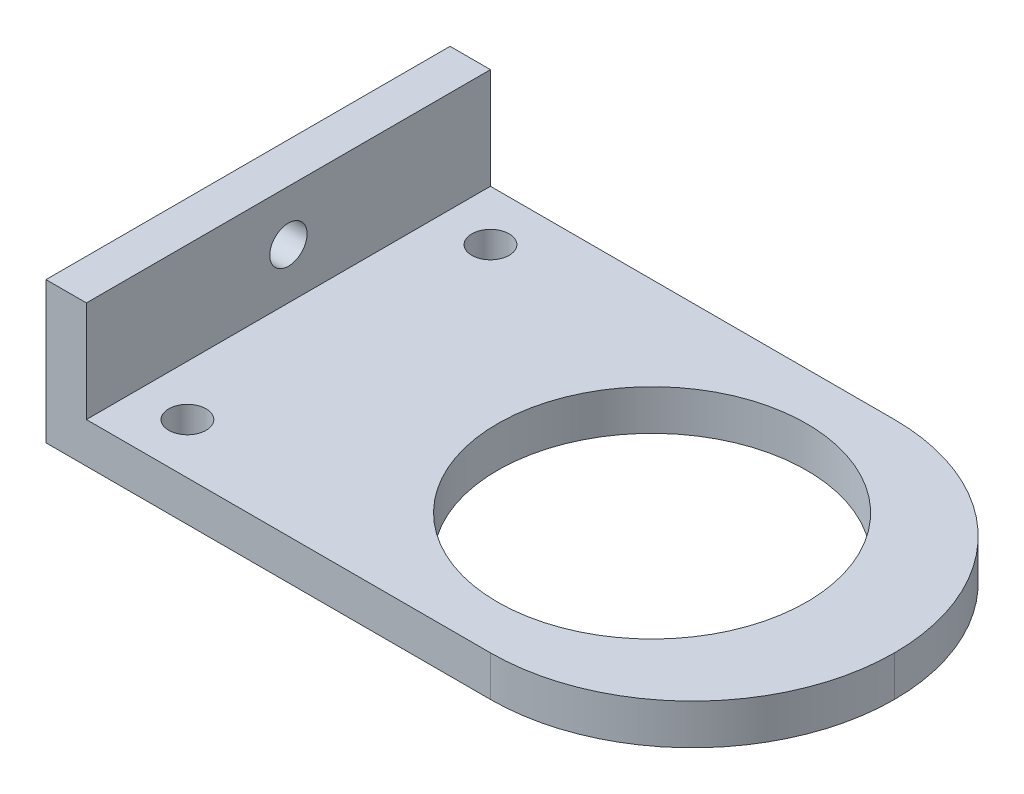
ISO-10303-21;
HEADER;
FILE_DESCRIPTION(('STEP AP214'),'2;1');
FILE_NAME('part.step','',(''),(''),'','','');
FILE_SCHEMA(('AUTOMOTIVE_DESIGN { 1 0 10303 214 1 1 1 1 }'));
ENDSEC;
DATA;
#1=APPLICATION_CONTEXT('core data for automotive mechanical design processes');
#2=APPLICATION_PROTOCOL_DEFINITION('international standard','automotive_design',2000,#1);
#3=PRODUCT_CONTEXT('',#1,'mechanical');
#4=PRODUCT('Part','Part','',(#3));
#5=PRODUCT_RELATED_PRODUCT_CATEGORY('part','',(#4));
#6=PRODUCT_DEFINITION_FORMATION('','',#4);
#7=PRODUCT_DEFINITION_CONTEXT('part definition',#1,'design');
#8=PRODUCT_DEFINITION('design','',#6,#7);
#9=PRODUCT_DEFINITION_SHAPE('','',#8);
#10=(LENGTH_UNIT() NAMED_UNIT(*) SI_UNIT(.MILLI.,.METRE.));
#11=(NAMED_UNIT(*) PLANE_ANGLE_UNIT() SI_UNIT($,.RADIAN.));
#12=(NAMED_UNIT(*) SI_UNIT($,.STERADIAN.) SOLID_ANGLE_UNIT());
#13=UNCERTAINTY_MEASURE_WITH_UNIT(LENGTH_MEASURE(1.E-05),#10,'distance_accuracy_value','');
#14=(GEOMETRIC_REPRESENTATION_CONTEXT(3) GLOBAL_UNCERTAINTY_ASSIGNED_CONTEXT((#13)) GLOBAL_UNIT_ASSIGNED_CONTEXT((#10,
#11,#12)) REPRESENTATION_CONTEXT('',''));
#15=CARTESIAN_POINT('',(0.,0.,0.));
#16=DIRECTION('',(0.,0.,1.));
#17=DIRECTION('',(1.,0.,0.));
#18=AXIS2_PLACEMENT_3D('',#15,#16,#17);
#19=CARTESIAN_POINT('',(0.,10.,40.));
#20=DIRECTION('',(0.,-1.,0.));
#21=DIRECTION('',(0.,0.,-1.));
#22=AXIS2_PLACEMENT_3D('',#19,#20,#21);
#23=PLANE('',#22);
#24=DIRECTION('',(-1.,0.,0.));
#25=VECTOR('',#24,1.);
#26=CARTESIAN_POINT('',(0.,10.,0.));
#27=LINE('',#26,#25);
#28=CARTESIAN_POINT('',(0.,10.,0.));
#29=VERTEX_POINT('',#28);
#30=CARTESIAN_POINT('',(-4.,10.,0.));
#31=VERTEX_POINT('',#30);
#32=EDGE_CURVE('E114',#29,#31,#27,.T.);
#33=ORIENTED_EDGE('',*,*,#32,.T.);
#34=DIRECTION('',(0.,0.,-1.));
#35=VECTOR('',#34,1.);
#36=CARTESIAN_POINT('',(-4.,10.,40.));
#37=LINE('',#36,#35);
#38=CARTESIAN_POINT('',(-4.,10.,40.));
#39=VERTEX_POINT('',#38);
#40=EDGE_CURVE('E96',#39,#31,#37,.T.);
#41=ORIENTED_EDGE('',*,*,#40,.F.);
#42=DIRECTION('',(-1.,0.,0.));
#43=VECTOR('',#42,1.);
#44=CARTESIAN_POINT('',(0.,10.,40.));
#45=LINE('',#44,#43);
#46=CARTESIAN_POINT('',(0.,10.,40.));
#47=VERTEX_POINT('',#46);
#48=EDGE_CURVE('E102',#47,#39,#45,.T.);
#49=ORIENTED_EDGE('',*,*,#48,.F.);
#50=DIRECTION('',(0.,0.,-1.));
#51=VECTOR('',#50,1.);
#52=CARTESIAN_POINT('',(0.,10.,40.));
#53=LINE('',#52,#51);
#54=EDGE_CURVE('E146',#47,#29,#53,.T.);
#55=ORIENTED_EDGE('',*,*,#54,.T.);
#56=EDGE_LOOP('',(#33,#41,#49,#55));
#57=FACE_BOUND('',#56,.T.);
#58=ADVANCED_FACE('F35',(#57),#23,.F.);
#59=CARTESIAN_POINT('',(-4.,10.,40.));
#60=DIRECTION('',(1.,0.,0.));
#61=DIRECTION('',(0.,0.,-1.));
#62=AXIS2_PLACEMENT_3D('',#59,#60,#61);
#63=PLANE('',#62);
#64=CARTESIAN_POINT('',(-4.,5.,20.));
#65=DIRECTION('',(1.,0.,0.));
#66=DIRECTION('',(0.,0.,-1.));
#67=AXIS2_PLACEMENT_3D('',#64,#65,#66);
#68=CIRCLE('',#67,1.85);
#69=CARTESIAN_POINT('',(-4.,5.,18.15));
#70=VERTEX_POINT('',#69);
#71=EDGE_CURVE('E153',#70,#70,#68,.T.);
#72=ORIENTED_EDGE('',*,*,#71,.T.);
#73=EDGE_LOOP('',(#72));
#74=FACE_BOUND('',#73,.T.);
#75=DIRECTION('',(0.,-1.,0.));
#76=VECTOR('',#75,1.);
#77=CARTESIAN_POINT('',(-4.,10.,0.));
#78=LINE('',#77,#76);
#79=CARTESIAN_POINT('',(-4.,-4.,0.));
#80=VERTEX_POINT('',#79);
#81=EDGE_CURVE('E139',#31,#80,#78,.T.);
#82=ORIENTED_EDGE('',*,*,#81,.T.);
#83=DIRECTION('',(0.,0.,-1.));
#84=VECTOR('',#83,1.);
#85=CARTESIAN_POINT('',(-4.,-4.,40.));
#86=LINE('',#85,#84);
#87=CARTESIAN_POINT('',(-4.,-4.,40.));
#88=VERTEX_POINT('',#87);
#89=EDGE_CURVE('E99',#88,#80,#86,.T.);
#90=ORIENTED_EDGE('',*,*,#89,.F.);
#91=DIRECTION('',(0.,-1.,0.));
#92=VECTOR('',#91,1.);
#93=CARTESIAN_POINT('',(-4.,10.,40.));
#94=LINE('',#93,#92);
#95=EDGE_CURVE('E92',#39,#88,#94,.T.);
#96=ORIENTED_EDGE('',*,*,#95,.F.);
#97=ORIENTED_EDGE('',*,*,#40,.T.);
#98=EDGE_LOOP('',(#82,#90,#96,#97));
#99=FACE_BOUND('',#98,.T.);
#100=ADVANCED_FACE('F94',(#74,#99),#63,.F.);
#101=CARTESIAN_POINT('',(-4.,-4.,40.));
#102=DIRECTION('',(0.,1.,0.));
#103=DIRECTION('',(0.,0.,1.));
#104=AXIS2_PLACEMENT_3D('',#101,#102,#103);
#105=PLANE('',#104);
#106=CARTESIAN_POINT('',(5.,-4.,5.));
#107=DIRECTION('',(0.,1.,0.));
#108=DIRECTION('',(0.,0.,1.));
#109=AXIS2_PLACEMENT_3D('',#106,#107,#108);
#110=CIRCLE('',#109,1.85);
#111=CARTESIAN_POINT('',(5.,-4.,6.85));
#112=VERTEX_POINT('',#111);
#113=EDGE_CURVE('E170',#112,#112,#110,.T.);
#114=ORIENTED_EDGE('',*,*,#113,.T.);
#115=EDGE_LOOP('',(#114));
#116=FACE_BOUND('',#115,.T.);
#117=CARTESIAN_POINT('',(5.,-4.,35.));
#118=DIRECTION('',(0.,1.,0.));
#119=DIRECTION('',(0.,0.,1.));
#120=AXIS2_PLACEMENT_3D('',#117,#118,#119);
#121=CIRCLE('',#120,1.85);
#122=CARTESIAN_POINT('',(5.,-4.,36.85));
#123=VERTEX_POINT('',#122);
#124=EDGE_CURVE('E173',#123,#123,#121,.T.);
#125=ORIENTED_EDGE('',*,*,#124,.T.);
#126=EDGE_LOOP('',(#125));
#127=FACE_BOUND('',#126,.T.);
#128=CARTESIAN_POINT('',(36.,-4.,20.));
#129=DIRECTION('',(0.,1.,0.));
#130=DIRECTION('',(0.,0.,1.));
#131=AXIS2_PLACEMENT_3D('',#128,#129,#130);
#132=CIRCLE('',#131,15.3);
#133=CARTESIAN_POINT('',(36.,-4.,35.3));
#134=VERTEX_POINT('',#133);
#135=EDGE_CURVE('E164',#134,#134,#132,.T.);
#136=ORIENTED_EDGE('',*,*,#135,.T.);
#137=EDGE_LOOP('',(#136));
#138=FACE_BOUND('',#137,.T.);
#139=DIRECTION('',(1.,0.,0.));
#140=VECTOR('',#139,1.);
#141=CARTESIAN_POINT('',(-4.,-4.,0.));
#142=LINE('',#141,#140);
#143=CARTESIAN_POINT('',(40.,-4.,0.));
#144=VERTEX_POINT('',#143);
#145=EDGE_CURVE('E133',#80,#144,#142,.T.);
#146=ORIENTED_EDGE('',*,*,#145,.T.);
#147=CARTESIAN_POINT('',(40.,-4.,20.));
#148=DIRECTION('',(0.,1.,0.));
#149=DIRECTION('',(0.,0.,1.));
#150=AXIS2_PLACEMENT_3D('',#147,#148,#149);
#151=CIRCLE('',#150,20.);
#152=CARTESIAN_POINT('',(60.,-4.,20.));
#153=VERTEX_POINT('',#152);
#154=EDGE_CURVE('E44',#144,#153,#151,.F.);
#155=ORIENTED_EDGE('',*,*,#154,.T.);
#156=CARTESIAN_POINT('',(40.,-4.,20.));
#157=DIRECTION('',(0.,1.,0.));
#158=DIRECTION('',(0.,0.,1.));
#159=AXIS2_PLACEMENT_3D('',#156,#157,#158);
#160=CIRCLE('',#159,20.);
#161=CARTESIAN_POINT('',(40.,-4.,40.));
#162=VERTEX_POINT('',#161);
#163=EDGE_CURVE('E51',#153,#162,#160,.F.);
#164=ORIENTED_EDGE('',*,*,#163,.T.);
#165=DIRECTION('',(1.,0.,0.));
#166=VECTOR('',#165,1.);
#167=CARTESIAN_POINT('',(-4.,-4.,40.));
#168=LINE('',#167,#166);
#169=EDGE_CURVE('E101',#88,#162,#168,.T.);
#170=ORIENTED_EDGE('',*,*,#169,.F.);
#171=ORIENTED_EDGE('',*,*,#89,.T.);
#172=EDGE_LOOP('',(#146,#155,#164,#170,#171));
#173=FACE_BOUND('',#172,.T.);
#174=ADVANCED_FACE('F138',(#116,#127,#138,#173),#105,.F.);
#175=CARTESIAN_POINT('',(0.,0.,40.));
#176=DIRECTION('',(0.,-1.,0.));
#177=DIRECTION('',(0.,0.,-1.));
#178=AXIS2_PLACEMENT_3D('',#175,#176,#177);
#179=PLANE('',#178);
#180=CARTESIAN_POINT('',(5.,0.,5.));
#181=DIRECTION('',(0.,1.,0.));
#182=DIRECTION('',(0.,0.,1.));
#183=AXIS2_PLACEMENT_3D('',#180,#181,#182);
#184=CIRCLE('',#183,1.85);
#185=CARTESIAN_POINT('',(5.,0.,6.85));
#186=VERTEX_POINT('',#185);
#187=EDGE_CURVE('E176',#186,#186,#184,.T.);
#188=ORIENTED_EDGE('',*,*,#187,.F.);
#189=EDGE_LOOP('',(#188));
#190=FACE_BOUND('',#189,.T.);
#191=CARTESIAN_POINT('',(5.,0.,35.));
#192=DIRECTION('',(0.,1.,0.));
#193=DIRECTION('',(0.,0.,1.));
#194=AXIS2_PLACEMENT_3D('',#191,#192,#193);
#195=CIRCLE('',#194,1.85);
#196=CARTESIAN_POINT('',(5.,0.,36.85));
#197=VERTEX_POINT('',#196);
#198=EDGE_CURVE('E177',#197,#197,#195,.T.);
#199=ORIENTED_EDGE('',*,*,#198,.F.);
#200=EDGE_LOOP('',(#199));
#201=FACE_BOUND('',#200,.T.);
#202=CARTESIAN_POINT('',(36.,0.,20.));
#203=DIRECTION('',(0.,1.,0.));
#204=DIRECTION('',(0.,0.,1.));
#205=AXIS2_PLACEMENT_3D('',#202,#203,#204);
#206=CIRCLE('',#205,15.3);
#207=CARTESIAN_POINT('',(36.,0.,35.3));
#208=VERTEX_POINT('',#207);
#209=EDGE_CURVE('E167',#208,#208,#206,.T.);
#210=ORIENTED_EDGE('',*,*,#209,.F.);
#211=EDGE_LOOP('',(#210));
#212=FACE_BOUND('',#211,.T.);
#213=CARTESIAN_POINT('',(40.,0.,20.));
#214=DIRECTION('',(0.,-1.,0.));
#215=DIRECTION('',(0.,0.,-1.));
#216=AXIS2_PLACEMENT_3D('',#213,#214,#215);
#217=CIRCLE('',#216,20.);
#218=CARTESIAN_POINT('',(40.,0.,40.));
#219=VERTEX_POINT('',#218);
#220=CARTESIAN_POINT('',(60.,0.,20.));
#221=VERTEX_POINT('',#220);
#222=EDGE_CURVE('E115',#219,#221,#217,.F.);
#223=ORIENTED_EDGE('',*,*,#222,.T.);
#224=CARTESIAN_POINT('',(40.,0.,20.));
#225=DIRECTION('',(0.,-1.,0.));
#226=DIRECTION('',(0.,0.,-1.));
#227=AXIS2_PLACEMENT_3D('',#224,#225,#226);
#228=CIRCLE('',#227,20.);
#229=CARTESIAN_POINT('',(40.,0.,0.));
#230=VERTEX_POINT('',#229);
#231=EDGE_CURVE('E117',#221,#230,#228,.F.);
#232=ORIENTED_EDGE('',*,*,#231,.T.);
#233=DIRECTION('',(-1.,0.,0.));
#234=VECTOR('',#233,1.);
#235=CARTESIAN_POINT('',(0.,0.,0.));
#236=LINE('',#235,#234);
#237=CARTESIAN_POINT('',(0.,0.,0.));
#238=VERTEX_POINT('',#237);
#239=EDGE_CURVE('E135',#230,#238,#236,.T.);
#240=ORIENTED_EDGE('',*,*,#239,.T.);
#241=DIRECTION('',(0.,0.,-1.));
#242=VECTOR('',#241,1.);
#243=CARTESIAN_POINT('',(0.,0.,40.));
#244=LINE('',#243,#242);
#245=CARTESIAN_POINT('',(0.,0.,40.));
#246=VERTEX_POINT('',#245);
#247=EDGE_CURVE('E119',#246,#238,#244,.T.);
#248=ORIENTED_EDGE('',*,*,#247,.F.);
#249=DIRECTION('',(-1.,0.,0.));
#250=VECTOR('',#249,1.);
#251=CARTESIAN_POINT('',(0.,0.,40.));
#252=LINE('',#251,#250);
#253=EDGE_CURVE('E159',#219,#246,#252,.T.);
#254=ORIENTED_EDGE('',*,*,#253,.F.);
#255=EDGE_LOOP('',(#223,#232,#240,#248,#254));
#256=FACE_BOUND('',#255,.T.);
#257=ADVANCED_FACE('F186',(#190,#201,#212,#256),#179,.F.);
#258=CARTESIAN_POINT('',(0.,10.,40.));
#259=DIRECTION('',(-1.,0.,0.));
#260=DIRECTION('',(0.,0.,1.));
#261=AXIS2_PLACEMENT_3D('',#258,#259,#260);
#262=PLANE('',#261);
#263=CARTESIAN_POINT('',(0.,5.,20.));
#264=DIRECTION('',(1.,0.,0.));
#265=DIRECTION('',(0.,0.,-1.));
#266=AXIS2_PLACEMENT_3D('',#263,#264,#265);
#267=CIRCLE('',#266,1.85);
#268=CARTESIAN_POINT('',(0.,5.,18.15));
#269=VERTEX_POINT('',#268);
#270=EDGE_CURVE('E155',#269,#269,#267,.T.);
#271=ORIENTED_EDGE('',*,*,#270,.F.);
#272=EDGE_LOOP('',(#271));
#273=FACE_BOUND('',#272,.T.);
#274=DIRECTION('',(0.,1.,0.));
#275=VECTOR('',#274,1.);
#276=CARTESIAN_POINT('',(0.,10.,0.));
#277=LINE('',#276,#275);
#278=EDGE_CURVE('E111',#238,#29,#277,.T.);
#279=ORIENTED_EDGE('',*,*,#278,.T.);
#280=ORIENTED_EDGE('',*,*,#54,.F.);
#281=DIRECTION('',(0.,1.,0.));
#282=VECTOR('',#281,1.);
#283=CARTESIAN_POINT('',(0.,10.,40.));
#284=LINE('',#283,#282);
#285=EDGE_CURVE('E107',#246,#47,#284,.T.);
#286=ORIENTED_EDGE('',*,*,#285,.F.);
#287=ORIENTED_EDGE('',*,*,#247,.T.);
#288=EDGE_LOOP('',(#279,#280,#286,#287));
#289=FACE_BOUND('',#288,.T.);
#290=ADVANCED_FACE('F150',(#273,#289),#262,.F.);
#291=CARTESIAN_POINT('',(0.,0.,40.));
#292=DIRECTION('',(0.,0.,1.));
#293=DIRECTION('',(1.,0.,0.));
#294=AXIS2_PLACEMENT_3D('',#291,#292,#293);
#295=PLANE('',#294);
#296=ORIENTED_EDGE('',*,*,#169,.T.);
#297=DIRECTION('',(0.,1.,0.));
#298=VECTOR('',#297,1.);
#299=CARTESIAN_POINT('',(40.,0.,40.));
#300=LINE('',#299,#298);
#301=EDGE_CURVE('E11',#162,#219,#300,.T.);
#302=ORIENTED_EDGE('',*,*,#301,.T.);
#303=ORIENTED_EDGE('',*,*,#253,.T.);
#304=ORIENTED_EDGE('',*,*,#285,.T.);
#305=ORIENTED_EDGE('',*,*,#48,.T.);
#306=ORIENTED_EDGE('',*,*,#95,.T.);
#307=EDGE_LOOP('',(#296,#302,#303,#304,#305,#306));
#308=FACE_BOUND('',#307,.T.);
#309=ADVANCED_FACE('F105',(#308),#295,.T.);
#310=CARTESIAN_POINT('',(0.,0.,0.));
#311=DIRECTION('',(0.,0.,1.));
#312=DIRECTION('',(1.,0.,0.));
#313=AXIS2_PLACEMENT_3D('',#310,#311,#312);
#314=PLANE('',#313);
#315=ORIENTED_EDGE('',*,*,#239,.F.);
#316=DIRECTION('',(0.,1.,0.));
#317=VECTOR('',#316,1.);
#318=CARTESIAN_POINT('',(40.,0.,0.));
#319=LINE('',#318,#317);
#320=EDGE_CURVE('E124',#230,#144,#319,.F.);
#321=ORIENTED_EDGE('',*,*,#320,.T.);
#322=ORIENTED_EDGE('',*,*,#145,.F.);
#323=ORIENTED_EDGE('',*,*,#81,.F.);
#324=ORIENTED_EDGE('',*,*,#32,.F.);
#325=ORIENTED_EDGE('',*,*,#278,.F.);
#326=EDGE_LOOP('',(#315,#321,#322,#323,#324,#325));
#327=FACE_BOUND('',#326,.T.);
#328=ADVANCED_FACE('F132',(#327),#314,.F.);
#329=CARTESIAN_POINT('',(-40.,5.,20.));
#330=DIRECTION('',(1.,0.,0.));
#331=DIRECTION('',(0.,0.,-1.));
#332=AXIS2_PLACEMENT_3D('',#329,#330,#331);
#333=CYLINDRICAL_SURFACE('',#332,1.85);
#334=ORIENTED_EDGE('',*,*,#270,.T.);
#335=EDGE_LOOP('',(#334));
#336=FACE_BOUND('',#335,.T.);
#337=ORIENTED_EDGE('',*,*,#71,.F.);
#338=EDGE_LOOP('',(#337));
#339=FACE_BOUND('',#338,.T.);
#340=ADVANCED_FACE('F219',(#336,#339),#333,.F.);
#341=CARTESIAN_POINT('',(36.,-40.,20.));
#342=DIRECTION('',(0.,1.,0.));
#343=DIRECTION('',(0.,0.,1.));
#344=AXIS2_PLACEMENT_3D('',#341,#342,#343);
#345=CYLINDRICAL_SURFACE('',#344,15.3);
#346=ORIENTED_EDGE('',*,*,#209,.T.);
#347=EDGE_LOOP('',(#346));
#348=FACE_BOUND('',#347,.T.);
#349=ORIENTED_EDGE('',*,*,#135,.F.);
#350=EDGE_LOOP('',(#349));
#351=FACE_BOUND('',#350,.T.);
#352=ADVANCED_FACE('F224',(#348,#351),#345,.F.);
#353=CARTESIAN_POINT('',(5.,-40.,35.));
#354=DIRECTION('',(0.,1.,0.));
#355=DIRECTION('',(0.,0.,1.));
#356=AXIS2_PLACEMENT_3D('',#353,#354,#355);
#357=CYLINDRICAL_SURFACE('',#356,1.85);
#358=ORIENTED_EDGE('',*,*,#198,.T.);
#359=EDGE_LOOP('',(#358));
#360=FACE_BOUND('',#359,.T.);
#361=ORIENTED_EDGE('',*,*,#124,.F.);
#362=EDGE_LOOP('',(#361));
#363=FACE_BOUND('',#362,.T.);
#364=ADVANCED_FACE('F228',(#360,#363),#357,.F.);
#365=CARTESIAN_POINT('',(5.,-40.,5.));
#366=DIRECTION('',(0.,1.,0.));
#367=DIRECTION('',(0.,0.,1.));
#368=AXIS2_PLACEMENT_3D('',#365,#366,#367);
#369=CYLINDRICAL_SURFACE('',#368,1.85);
#370=ORIENTED_EDGE('',*,*,#187,.T.);
#371=EDGE_LOOP('',(#370));
#372=FACE_BOUND('',#371,.T.);
#373=ORIENTED_EDGE('',*,*,#113,.F.);
#374=EDGE_LOOP('',(#373));
#375=FACE_BOUND('',#374,.T.);
#376=ADVANCED_FACE('F183',(#372,#375),#369,.F.);
#377=CARTESIAN_POINT('',(40.,0.,20.));
#378=DIRECTION('',(0.,-1.,0.));
#379=DIRECTION('',(0.,0.,-1.));
#380=AXIS2_PLACEMENT_3D('',#377,#378,#379);
#381=CYLINDRICAL_SURFACE('',#380,20.);
#382=ORIENTED_EDGE('',*,*,#301,.F.);
#383=ORIENTED_EDGE('',*,*,#163,.F.);
#384=DIRECTION('',(0.,1.,0.));
#385=VECTOR('',#384,1.);
#386=CARTESIAN_POINT('',(60.,-4.,20.));
#387=LINE('',#386,#385);
#388=EDGE_CURVE('E39',#221,#153,#387,.F.);
#389=ORIENTED_EDGE('',*,*,#388,.F.);
#390=ORIENTED_EDGE('',*,*,#222,.F.);
#391=EDGE_LOOP('',(#382,#383,#389,#390));
#392=FACE_BOUND('',#391,.T.);
#393=ADVANCED_FACE('F37',(#392),#381,.T.);
#394=CARTESIAN_POINT('',(40.,0.,20.));
#395=DIRECTION('',(0.,1.,0.));
#396=DIRECTION('',(0.,0.,1.));
#397=AXIS2_PLACEMENT_3D('',#394,#395,#396);
#398=CYLINDRICAL_SURFACE('',#397,20.);
#399=ORIENTED_EDGE('',*,*,#154,.F.);
#400=ORIENTED_EDGE('',*,*,#320,.F.);
#401=ORIENTED_EDGE('',*,*,#231,.F.);
#402=ORIENTED_EDGE('',*,*,#388,.T.);
#403=EDGE_LOOP('',(#399,#400,#401,#402));
#404=FACE_BOUND('',#403,.T.);
#405=ADVANCED_FACE('F198',(#404),#398,.T.);
#406=CLOSED_SHELL('',(#58,#100,#174,#257,#290,#309,#328,#340,#352,#364,#376,#393,#405));
#407=MANIFOLD_SOLID_BREP('B2',#406);
#408=ADVANCED_BREP_SHAPE_REPRESENTATION('',(#18,#407),#14);
#409=SHAPE_DEFINITION_REPRESENTATION(#9,#408);
ENDSEC;
END-ISO-10303-21;
